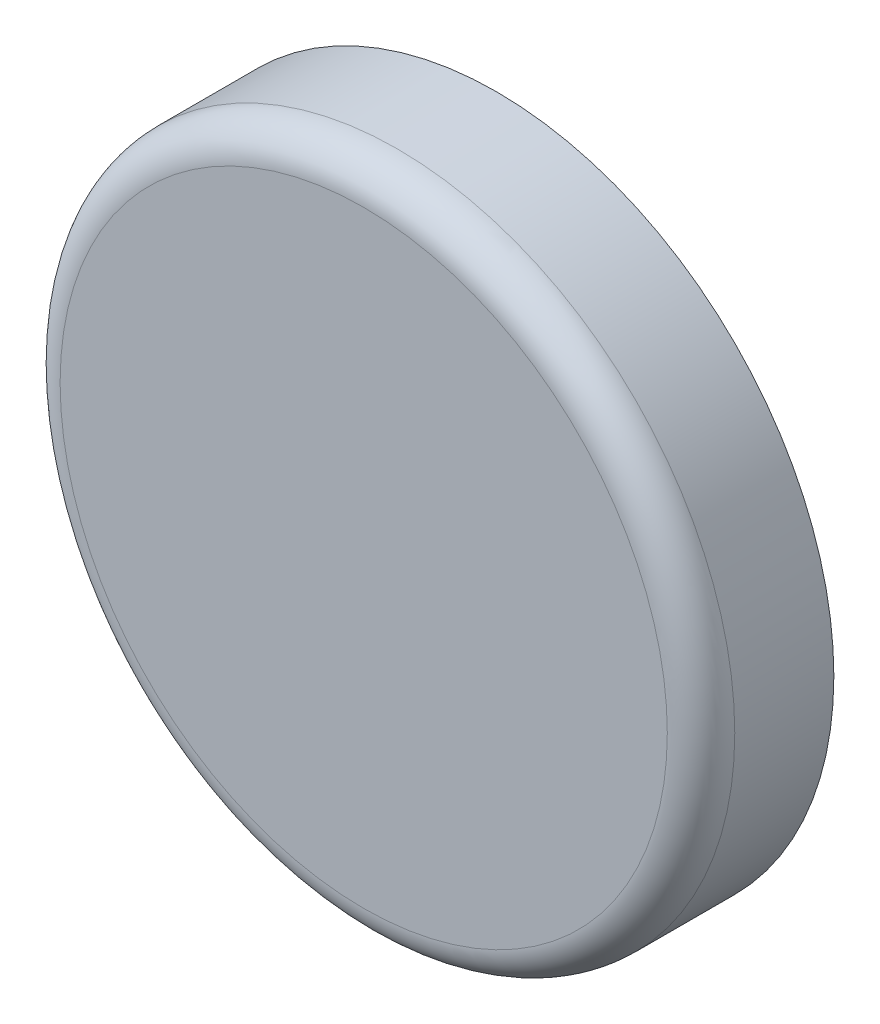
ISO-10303-21;
HEADER;
FILE_DESCRIPTION(('STEP AP214'),'2;1');
FILE_NAME('part.step','',(''),(''),'','','');
FILE_SCHEMA(('AUTOMOTIVE_DESIGN { 1 0 10303 214 1 1 1 1 }'));
ENDSEC;
DATA;
#1=APPLICATION_CONTEXT('core data for automotive mechanical design processes');
#2=APPLICATION_PROTOCOL_DEFINITION('international standard','automotive_design',2000,#1);
#3=PRODUCT_CONTEXT('',#1,'mechanical');
#4=PRODUCT('Part','Part','',(#3));
#5=PRODUCT_RELATED_PRODUCT_CATEGORY('part','',(#4));
#6=PRODUCT_DEFINITION_FORMATION('','',#4);
#7=PRODUCT_DEFINITION_CONTEXT('part definition',#1,'design');
#8=PRODUCT_DEFINITION('design','',#6,#7);
#9=PRODUCT_DEFINITION_SHAPE('','',#8);
#10=(LENGTH_UNIT() NAMED_UNIT(*) SI_UNIT(.MILLI.,.METRE.));
#11=(NAMED_UNIT(*) PLANE_ANGLE_UNIT() SI_UNIT($,.RADIAN.));
#12=(NAMED_UNIT(*) SI_UNIT($,.STERADIAN.) SOLID_ANGLE_UNIT());
#13=UNCERTAINTY_MEASURE_WITH_UNIT(LENGTH_MEASURE(1.E-05),#10,'distance_accuracy_value','');
#14=(GEOMETRIC_REPRESENTATION_CONTEXT(3) GLOBAL_UNCERTAINTY_ASSIGNED_CONTEXT((#13)) GLOBAL_UNIT_ASSIGNED_CONTEXT((#10,
#11,#12)) REPRESENTATION_CONTEXT('',''));
#15=CARTESIAN_POINT('',(0.,0.,0.));
#16=DIRECTION('',(0.,0.,1.));
#17=DIRECTION('',(1.,0.,0.));
#18=AXIS2_PLACEMENT_3D('',#15,#16,#17);
#19=CARTESIAN_POINT('',(0.,0.,5.));
#20=DIRECTION('',(0.,0.,-1.));
#21=DIRECTION('',(-1.,0.,0.));
#22=AXIS2_PLACEMENT_3D('',#19,#20,#21);
#23=CYLINDRICAL_SURFACE('',#22,12.7);
#24=CARTESIAN_POINT('',(0.,0.,3.73));
#25=DIRECTION('',(0.,0.,1.));
#26=DIRECTION('',(1.,0.,0.));
#27=AXIS2_PLACEMENT_3D('',#24,#25,#26);
#28=CIRCLE('',#27,12.7);
#29=CARTESIAN_POINT('',(12.7,0.,3.73));
#30=VERTEX_POINT('',#29);
#31=EDGE_CURVE('E10',#30,#30,#28,.F.);
#32=ORIENTED_EDGE('',*,*,#31,.T.);
#33=EDGE_LOOP('',(#32));
#34=FACE_BOUND('',#33,.T.);
#35=CARTESIAN_POINT('',(0.,0.,0.));
#36=DIRECTION('',(0.,0.,1.));
#37=DIRECTION('',(1.,0.,0.));
#38=AXIS2_PLACEMENT_3D('',#35,#36,#37);
#39=CIRCLE('',#38,12.7);
#40=CARTESIAN_POINT('',(12.7,0.,0.));
#41=VERTEX_POINT('',#40);
#42=EDGE_CURVE('E52',#41,#41,#39,.T.);
#43=ORIENTED_EDGE('',*,*,#42,.T.);
#44=EDGE_LOOP('',(#43));
#45=FACE_BOUND('',#44,.T.);
#46=ADVANCED_FACE('F37',(#34,#45),#23,.T.);
#47=CARTESIAN_POINT('',(0.,0.,5.));
#48=DIRECTION('',(0.,0.,1.));
#49=DIRECTION('',(1.,0.,0.));
#50=AXIS2_PLACEMENT_3D('',#47,#48,#49);
#51=PLANE('',#50);
#52=CARTESIAN_POINT('',(0.,0.,5.));
#53=DIRECTION('',(0.,0.,1.));
#54=DIRECTION('',(1.,0.,0.));
#55=AXIS2_PLACEMENT_3D('',#52,#53,#54);
#56=CIRCLE('',#55,11.43);
#57=CARTESIAN_POINT('',(11.43,0.,5.));
#58=VERTEX_POINT('',#57);
#59=EDGE_CURVE('E44',#58,#58,#56,.T.);
#60=ORIENTED_EDGE('',*,*,#59,.T.);
#61=EDGE_LOOP('',(#60));
#62=FACE_BOUND('',#61,.T.);
#63=ADVANCED_FACE('F72',(#62),#51,.T.);
#64=CARTESIAN_POINT('',(0.,0.,0.));
#65=DIRECTION('',(0.,0.,1.));
#66=DIRECTION('',(1.,0.,0.));
#67=AXIS2_PLACEMENT_3D('',#64,#65,#66);
#68=PLANE('',#67);
#69=CARTESIAN_POINT('',(0.,0.,0.));
#70=DIRECTION('',(0.,0.,1.));
#71=DIRECTION('',(1.,0.,0.));
#72=AXIS2_PLACEMENT_3D('',#69,#70,#71);
#73=CIRCLE('',#72,1.5);
#74=CARTESIAN_POINT('',(1.5,0.,0.));
#75=VERTEX_POINT('',#74);
#76=EDGE_CURVE('E48',#75,#75,#73,.F.);
#77=ORIENTED_EDGE('',*,*,#76,.F.);
#78=EDGE_LOOP('',(#77));
#79=FACE_BOUND('',#78,.T.);
#80=ORIENTED_EDGE('',*,*,#42,.F.);
#81=EDGE_LOOP('',(#80));
#82=FACE_BOUND('',#81,.T.);
#83=ADVANCED_FACE('F66',(#79,#82),#68,.F.);
#84=CARTESIAN_POINT('',(0.,0.,-6.35));
#85=DIRECTION('',(0.,0.,1.));
#86=DIRECTION('',(1.,0.,0.));
#87=AXIS2_PLACEMENT_3D('',#84,#85,#86);
#88=CYLINDRICAL_SURFACE('',#87,1.5);
#89=CARTESIAN_POINT('',(0.,0.,-6.35));
#90=DIRECTION('',(0.,0.,-1.));
#91=DIRECTION('',(-1.,0.,0.));
#92=AXIS2_PLACEMENT_3D('',#89,#90,#91);
#93=CIRCLE('',#92,1.5);
#94=CARTESIAN_POINT('',(-1.5,0.,-6.35));
#95=VERTEX_POINT('',#94);
#96=EDGE_CURVE('E57',#95,#95,#93,.T.);
#97=ORIENTED_EDGE('',*,*,#96,.F.);
#98=EDGE_LOOP('',(#97));
#99=FACE_BOUND('',#98,.T.);
#100=ORIENTED_EDGE('',*,*,#76,.T.);
#101=EDGE_LOOP('',(#100));
#102=FACE_BOUND('',#101,.T.);
#103=ADVANCED_FACE('F63',(#99,#102),#88,.T.);
#104=CARTESIAN_POINT('',(0.,0.,-6.35));
#105=DIRECTION('',(0.,0.,-1.));
#106=DIRECTION('',(-1.,0.,0.));
#107=AXIS2_PLACEMENT_3D('',#104,#105,#106);
#108=PLANE('',#107);
#109=ORIENTED_EDGE('',*,*,#96,.T.);
#110=EDGE_LOOP('',(#109));
#111=FACE_BOUND('',#110,.T.);
#112=ADVANCED_FACE('F61',(#111),#108,.T.);
#113=CARTESIAN_POINT('',(0.,0.,3.73));
#114=DIRECTION('',(0.,0.,1.));
#115=DIRECTION('',(1.,0.,0.));
#116=AXIS2_PLACEMENT_3D('',#113,#114,#115);
#117=TOROIDAL_SURFACE('',#116,11.43,1.27);
#118=ORIENTED_EDGE('',*,*,#31,.F.);
#119=EDGE_LOOP('',(#118));
#120=FACE_BOUND('',#119,.T.);
#121=ORIENTED_EDGE('',*,*,#59,.F.);
#122=EDGE_LOOP('',(#121));
#123=FACE_BOUND('',#122,.T.);
#124=ADVANCED_FACE('F39',(#120,#123),#117,.T.);
#125=CLOSED_SHELL('',(#46,#63,#83,#103,#112,#124));
#126=MANIFOLD_SOLID_BREP('B2',#125);
#127=ADVANCED_BREP_SHAPE_REPRESENTATION('',(#18,#126),#14);
#128=SHAPE_DEFINITION_REPRESENTATION(#9,#127);
ENDSEC;
END-ISO-10303-21;
